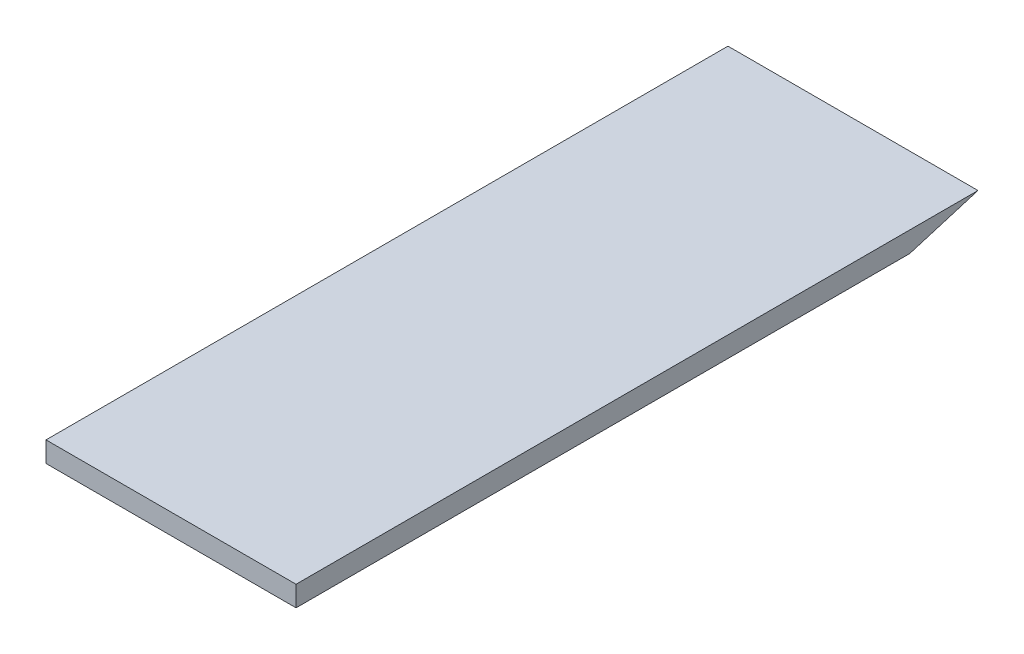
ISO-10303-21;
HEADER;
FILE_DESCRIPTION(('STEP AP214'),'2;1');
FILE_NAME('part.step','',(''),(''),'','','');
FILE_SCHEMA(('AUTOMOTIVE_DESIGN { 1 0 10303 214 1 1 1 1 }'));
ENDSEC;
DATA;
#1=APPLICATION_CONTEXT('core data for automotive mechanical design processes');
#2=APPLICATION_PROTOCOL_DEFINITION('international standard','automotive_design',2000,#1);
#3=PRODUCT_CONTEXT('',#1,'mechanical');
#4=PRODUCT('Part','Part','',(#3));
#5=PRODUCT_RELATED_PRODUCT_CATEGORY('part','',(#4));
#6=PRODUCT_DEFINITION_FORMATION('','',#4);
#7=PRODUCT_DEFINITION_CONTEXT('part definition',#1,'design');
#8=PRODUCT_DEFINITION('design','',#6,#7);
#9=PRODUCT_DEFINITION_SHAPE('','',#8);
#10=(LENGTH_UNIT() NAMED_UNIT(*) SI_UNIT(.MILLI.,.METRE.));
#11=(NAMED_UNIT(*) PLANE_ANGLE_UNIT() SI_UNIT($,.RADIAN.));
#12=(NAMED_UNIT(*) SI_UNIT($,.STERADIAN.) SOLID_ANGLE_UNIT());
#13=UNCERTAINTY_MEASURE_WITH_UNIT(LENGTH_MEASURE(1.E-05),#10,'distance_accuracy_value','');
#14=(GEOMETRIC_REPRESENTATION_CONTEXT(3) GLOBAL_UNCERTAINTY_ASSIGNED_CONTEXT((#13)) GLOBAL_UNIT_ASSIGNED_CONTEXT((#10,
#11,#12)) REPRESENTATION_CONTEXT('',''));
#15=CARTESIAN_POINT('',(0.,0.,0.));
#16=DIRECTION('',(0.,0.,1.));
#17=DIRECTION('',(1.,0.,0.));
#18=AXIS2_PLACEMENT_3D('',#15,#16,#17);
#19=CARTESIAN_POINT('',(110.,9.,0.));
#20=DIRECTION('',(0.,1.,0.));
#21=DIRECTION('',(0.,0.,1.));
#22=AXIS2_PLACEMENT_3D('',#19,#20,#21);
#23=PLANE('',#22);
#24=DIRECTION('',(0.,0.,-1.));
#25=VECTOR('',#24,1.);
#26=CARTESIAN_POINT('',(0.,9.,0.));
#27=LINE('',#26,#25);
#28=CARTESIAN_POINT('',(0.,9.,0.));
#29=VERTEX_POINT('',#28);
#30=CARTESIAN_POINT('',(0.,9.,-300.));
#31=VERTEX_POINT('',#30);
#32=EDGE_CURVE('E110',#29,#31,#27,.T.);
#33=ORIENTED_EDGE('',*,*,#32,.F.);
#34=DIRECTION('',(-1.,0.,0.));
#35=VECTOR('',#34,1.);
#36=CARTESIAN_POINT('',(110.,9.,0.));
#37=LINE('',#36,#35);
#38=CARTESIAN_POINT('',(110.,9.,0.));
#39=VERTEX_POINT('',#38);
#40=EDGE_CURVE('E11',#39,#29,#37,.T.);
#41=ORIENTED_EDGE('',*,*,#40,.F.);
#42=DIRECTION('',(0.,0.,-1.));
#43=VECTOR('',#42,1.);
#44=CARTESIAN_POINT('',(110.,9.,0.));
#45=LINE('',#44,#43);
#46=CARTESIAN_POINT('',(110.,9.,-300.));
#47=VERTEX_POINT('',#46);
#48=EDGE_CURVE('E103',#39,#47,#45,.T.);
#49=ORIENTED_EDGE('',*,*,#48,.T.);
#50=DIRECTION('',(-1.,0.,0.));
#51=VECTOR('',#50,1.);
#52=CARTESIAN_POINT('',(110.,9.,-300.));
#53=LINE('',#52,#51);
#54=EDGE_CURVE('E42',#47,#31,#53,.T.);
#55=ORIENTED_EDGE('',*,*,#54,.T.);
#56=EDGE_LOOP('',(#33,#41,#49,#55));
#57=FACE_BOUND('',#56,.T.);
#58=ADVANCED_FACE('F39',(#57),#23,.T.);
#59=CARTESIAN_POINT('',(110.,9.,0.));
#60=DIRECTION('',(0.,0.,-1.));
#61=DIRECTION('',(0.,1.,0.));
#62=AXIS2_PLACEMENT_3D('',#59,#60,#61);
#63=PLANE('',#62);
#64=DIRECTION('',(0.,-1.,0.));
#65=VECTOR('',#64,1.);
#66=CARTESIAN_POINT('',(0.,9.,0.));
#67=LINE('',#66,#65);
#68=CARTESIAN_POINT('',(0.,0.,0.));
#69=VERTEX_POINT('',#68);
#70=EDGE_CURVE('E73',#29,#69,#67,.T.);
#71=ORIENTED_EDGE('',*,*,#70,.T.);
#72=DIRECTION('',(-1.,0.,0.));
#73=VECTOR('',#72,1.);
#74=CARTESIAN_POINT('',(110.,0.,0.));
#75=LINE('',#74,#73);
#76=CARTESIAN_POINT('',(110.,0.,0.));
#77=VERTEX_POINT('',#76);
#78=EDGE_CURVE('E49',#77,#69,#75,.T.);
#79=ORIENTED_EDGE('',*,*,#78,.F.);
#80=DIRECTION('',(0.,-1.,0.));
#81=VECTOR('',#80,1.);
#82=CARTESIAN_POINT('',(110.,9.,0.));
#83=LINE('',#82,#81);
#84=EDGE_CURVE('E88',#39,#77,#83,.T.);
#85=ORIENTED_EDGE('',*,*,#84,.F.);
#86=ORIENTED_EDGE('',*,*,#40,.T.);
#87=EDGE_LOOP('',(#71,#79,#85,#86));
#88=FACE_BOUND('',#87,.T.);
#89=ADVANCED_FACE('F126',(#88),#63,.F.);
#90=CARTESIAN_POINT('',(110.,0.,0.));
#91=DIRECTION('',(0.,1.,0.));
#92=DIRECTION('',(0.,0.,1.));
#93=AXIS2_PLACEMENT_3D('',#90,#91,#92);
#94=PLANE('',#93);
#95=DIRECTION('',(0.,0.,-1.));
#96=VECTOR('',#95,1.);
#97=CARTESIAN_POINT('',(0.,0.,0.));
#98=LINE('',#97,#96);
#99=CARTESIAN_POINT('',(0.,0.,-270.));
#100=VERTEX_POINT('',#99);
#101=EDGE_CURVE('E96',#69,#100,#98,.T.);
#102=ORIENTED_EDGE('',*,*,#101,.T.);
#103=DIRECTION('',(-1.,0.,0.));
#104=VECTOR('',#103,1.);
#105=CARTESIAN_POINT('',(110.,0.,-270.));
#106=LINE('',#105,#104);
#107=CARTESIAN_POINT('',(110.,0.,-270.));
#108=VERTEX_POINT('',#107);
#109=EDGE_CURVE('E93',#108,#100,#106,.T.);
#110=ORIENTED_EDGE('',*,*,#109,.F.);
#111=DIRECTION('',(0.,0.,-1.));
#112=VECTOR('',#111,1.);
#113=CARTESIAN_POINT('',(110.,0.,0.));
#114=LINE('',#113,#112);
#115=EDGE_CURVE('E85',#77,#108,#114,.T.);
#116=ORIENTED_EDGE('',*,*,#115,.F.);
#117=ORIENTED_EDGE('',*,*,#78,.T.);
#118=EDGE_LOOP('',(#102,#110,#116,#117));
#119=FACE_BOUND('',#118,.T.);
#120=ADVANCED_FACE('F94',(#119),#94,.F.);
#121=CARTESIAN_POINT('',(110.,0.,-270.));
#122=DIRECTION('',(0.,0.957826285221152,0.287347885566345));
#123=DIRECTION('',(0.,-0.287347885566345,0.957826285221152));
#124=AXIS2_PLACEMENT_3D('',#121,#122,#123);
#125=PLANE('',#124);
#126=DIRECTION('',(0.,0.287347885566345,-0.957826285221152));
#127=VECTOR('',#126,1.);
#128=CARTESIAN_POINT('',(0.,0.,-270.));
#129=LINE('',#128,#127);
#130=EDGE_CURVE('E114',#100,#31,#129,.T.);
#131=ORIENTED_EDGE('',*,*,#130,.T.);
#132=ORIENTED_EDGE('',*,*,#54,.F.);
#133=DIRECTION('',(0.,0.287347885566345,-0.957826285221152));
#134=VECTOR('',#133,1.);
#135=CARTESIAN_POINT('',(110.,0.,-270.));
#136=LINE('',#135,#134);
#137=EDGE_CURVE('E82',#108,#47,#136,.T.);
#138=ORIENTED_EDGE('',*,*,#137,.F.);
#139=ORIENTED_EDGE('',*,*,#109,.T.);
#140=EDGE_LOOP('',(#131,#132,#138,#139));
#141=FACE_BOUND('',#140,.T.);
#142=ADVANCED_FACE('F101',(#141),#125,.F.);
#143=CARTESIAN_POINT('',(110.,0.,0.));
#144=DIRECTION('',(-1.,0.,0.));
#145=DIRECTION('',(0.,0.,1.));
#146=AXIS2_PLACEMENT_3D('',#143,#144,#145);
#147=PLANE('',#146);
#148=ORIENTED_EDGE('',*,*,#48,.F.);
#149=ORIENTED_EDGE('',*,*,#84,.T.);
#150=ORIENTED_EDGE('',*,*,#115,.T.);
#151=ORIENTED_EDGE('',*,*,#137,.T.);
#152=EDGE_LOOP('',(#148,#149,#150,#151));
#153=FACE_BOUND('',#152,.T.);
#154=ADVANCED_FACE('F87',(#153),#147,.F.);
#155=CARTESIAN_POINT('',(0.,0.,0.));
#156=DIRECTION('',(-1.,0.,0.));
#157=DIRECTION('',(0.,0.,1.));
#158=AXIS2_PLACEMENT_3D('',#155,#156,#157);
#159=PLANE('',#158);
#160=ORIENTED_EDGE('',*,*,#32,.T.);
#161=ORIENTED_EDGE('',*,*,#130,.F.);
#162=ORIENTED_EDGE('',*,*,#101,.F.);
#163=ORIENTED_EDGE('',*,*,#70,.F.);
#164=EDGE_LOOP('',(#160,#161,#162,#163));
#165=FACE_BOUND('',#164,.T.);
#166=ADVANCED_FACE('F123',(#165),#159,.T.);
#167=CLOSED_SHELL('',(#58,#89,#120,#142,#154,#166));
#168=MANIFOLD_SOLID_BREP('B2',#167);
#169=ADVANCED_BREP_SHAPE_REPRESENTATION('',(#18,#168),#14);
#170=SHAPE_DEFINITION_REPRESENTATION(#9,#169);
ENDSEC;
END-ISO-10303-21;
